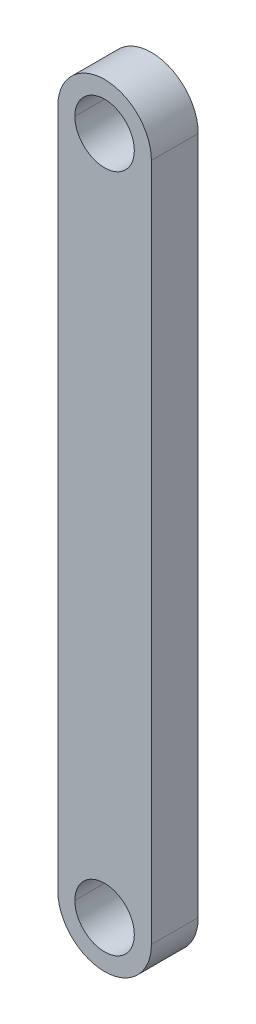
ISO-10303-21;
HEADER;
FILE_DESCRIPTION(('STEP AP214'),'2;1');
FILE_NAME('part.step','',(''),(''),'','','');
FILE_SCHEMA(('AUTOMOTIVE_DESIGN { 1 0 10303 214 1 1 1 1 }'));
ENDSEC;
DATA;
#1=APPLICATION_CONTEXT('core data for automotive mechanical design processes');
#2=APPLICATION_PROTOCOL_DEFINITION('international standard','automotive_design',2000,#1);
#3=PRODUCT_CONTEXT('',#1,'mechanical');
#4=PRODUCT('Part','Part','',(#3));
#5=PRODUCT_RELATED_PRODUCT_CATEGORY('part','',(#4));
#6=PRODUCT_DEFINITION_FORMATION('','',#4);
#7=PRODUCT_DEFINITION_CONTEXT('part definition',#1,'design');
#8=PRODUCT_DEFINITION('design','',#6,#7);
#9=PRODUCT_DEFINITION_SHAPE('','',#8);
#10=(LENGTH_UNIT() NAMED_UNIT(*) SI_UNIT(.MILLI.,.METRE.));
#11=(NAMED_UNIT(*) PLANE_ANGLE_UNIT() SI_UNIT($,.RADIAN.));
#12=(NAMED_UNIT(*) SI_UNIT($,.STERADIAN.) SOLID_ANGLE_UNIT());
#13=UNCERTAINTY_MEASURE_WITH_UNIT(LENGTH_MEASURE(1.E-05),#10,'distance_accuracy_value','');
#14=(GEOMETRIC_REPRESENTATION_CONTEXT(3) GLOBAL_UNCERTAINTY_ASSIGNED_CONTEXT((#13)) GLOBAL_UNIT_ASSIGNED_CONTEXT((#10,
#11,#12)) REPRESENTATION_CONTEXT('',''));
#15=CARTESIAN_POINT('',(0.,0.,0.));
#16=DIRECTION('',(0.,0.,1.));
#17=DIRECTION('',(1.,0.,0.));
#18=AXIS2_PLACEMENT_3D('',#15,#16,#17);
#19=CARTESIAN_POINT('',(0.,145.,0.));
#20=DIRECTION('',(0.,0.,1.));
#21=DIRECTION('',(1.,0.,0.));
#22=AXIS2_PLACEMENT_3D('',#19,#20,#21);
#23=CYLINDRICAL_SURFACE('',#22,6.35);
#24=DIRECTION('',(0.,0.,1.));
#25=VECTOR('',#24,1.);
#26=CARTESIAN_POINT('',(-6.35,145.,0.));
#27=LINE('',#26,#25);
#28=CARTESIAN_POINT('',(-6.35,145.,0.));
#29=VERTEX_POINT('',#28);
#30=CARTESIAN_POINT('',(-6.35,145.,10.));
#31=VERTEX_POINT('',#30);
#32=EDGE_CURVE('E109',#29,#31,#27,.T.);
#33=ORIENTED_EDGE('',*,*,#32,.F.);
#34=CARTESIAN_POINT('',(0.,145.,0.));
#35=DIRECTION('',(0.,0.,1.));
#36=DIRECTION('',(1.,0.,0.));
#37=AXIS2_PLACEMENT_3D('',#34,#35,#36);
#38=CIRCLE('',#37,6.35);
#39=CARTESIAN_POINT('',(6.35,145.,0.));
#40=VERTEX_POINT('',#39);
#41=EDGE_CURVE('E26',#40,#29,#38,.T.);
#42=ORIENTED_EDGE('',*,*,#41,.F.);
#43=DIRECTION('',(0.,0.,1.));
#44=VECTOR('',#43,1.);
#45=CARTESIAN_POINT('',(6.35,145.,0.));
#46=LINE('',#45,#44);
#47=CARTESIAN_POINT('',(6.35,145.,10.));
#48=VERTEX_POINT('',#47);
#49=EDGE_CURVE('E118',#40,#48,#46,.T.);
#50=ORIENTED_EDGE('',*,*,#49,.T.);
#51=CARTESIAN_POINT('',(0.,145.,10.));
#52=DIRECTION('',(0.,0.,1.));
#53=DIRECTION('',(1.,0.,0.));
#54=AXIS2_PLACEMENT_3D('',#51,#52,#53);
#55=CIRCLE('',#54,6.35);
#56=EDGE_CURVE('E110',#48,#31,#55,.T.);
#57=ORIENTED_EDGE('',*,*,#56,.T.);
#58=EDGE_LOOP('',(#33,#42,#50,#57));
#59=FACE_BOUND('',#58,.T.);
#60=ADVANCED_FACE('F15',(#59),#23,.F.);
#61=CARTESIAN_POINT('',(0.,0.,0.));
#62=DIRECTION('',(0.,0.,1.));
#63=DIRECTION('',(1.,0.,0.));
#64=AXIS2_PLACEMENT_3D('',#61,#62,#63);
#65=CYLINDRICAL_SURFACE('',#64,6.35);
#66=DIRECTION('',(0.,0.,1.));
#67=VECTOR('',#66,1.);
#68=CARTESIAN_POINT('',(-6.35,0.,0.));
#69=LINE('',#68,#67);
#70=CARTESIAN_POINT('',(-6.35,0.,0.));
#71=VERTEX_POINT('',#70);
#72=CARTESIAN_POINT('',(-6.35,0.,10.));
#73=VERTEX_POINT('',#72);
#74=EDGE_CURVE('E131',#71,#73,#69,.T.);
#75=ORIENTED_EDGE('',*,*,#74,.F.);
#76=CARTESIAN_POINT('',(0.,0.,0.));
#77=DIRECTION('',(0.,0.,1.));
#78=DIRECTION('',(1.,0.,0.));
#79=AXIS2_PLACEMENT_3D('',#76,#77,#78);
#80=CIRCLE('',#79,6.35);
#81=CARTESIAN_POINT('',(6.35,0.,0.));
#82=VERTEX_POINT('',#81);
#83=EDGE_CURVE('E10',#82,#71,#80,.T.);
#84=ORIENTED_EDGE('',*,*,#83,.F.);
#85=DIRECTION('',(0.,0.,1.));
#86=VECTOR('',#85,1.);
#87=CARTESIAN_POINT('',(6.35,0.,0.));
#88=LINE('',#87,#86);
#89=CARTESIAN_POINT('',(6.35,0.,10.));
#90=VERTEX_POINT('',#89);
#91=EDGE_CURVE('E168',#82,#90,#88,.T.);
#92=ORIENTED_EDGE('',*,*,#91,.T.);
#93=CARTESIAN_POINT('',(0.,0.,10.));
#94=DIRECTION('',(0.,0.,1.));
#95=DIRECTION('',(1.,0.,0.));
#96=AXIS2_PLACEMENT_3D('',#93,#94,#95);
#97=CIRCLE('',#96,6.35);
#98=EDGE_CURVE('E106',#90,#73,#97,.T.);
#99=ORIENTED_EDGE('',*,*,#98,.T.);
#100=EDGE_LOOP('',(#75,#84,#92,#99));
#101=FACE_BOUND('',#100,.T.);
#102=ADVANCED_FACE('F220',(#101),#65,.F.);
#103=CARTESIAN_POINT('',(0.,0.,0.));
#104=DIRECTION('',(0.,0.,1.));
#105=DIRECTION('',(1.,0.,0.));
#106=AXIS2_PLACEMENT_3D('',#103,#104,#105);
#107=PLANE('',#106);
#108=ORIENTED_EDGE('',*,*,#83,.T.);
#109=CARTESIAN_POINT('',(0.,0.,0.));
#110=DIRECTION('',(0.,0.,1.));
#111=DIRECTION('',(1.,0.,0.));
#112=AXIS2_PLACEMENT_3D('',#109,#110,#111);
#113=CIRCLE('',#112,6.35);
#114=EDGE_CURVE('E128',#71,#82,#113,.T.);
#115=ORIENTED_EDGE('',*,*,#114,.T.);
#116=EDGE_LOOP('',(#108,#115));
#117=FACE_BOUND('',#116,.T.);
#118=ORIENTED_EDGE('',*,*,#41,.T.);
#119=CARTESIAN_POINT('',(0.,145.,0.));
#120=DIRECTION('',(0.,0.,1.));
#121=DIRECTION('',(1.,0.,0.));
#122=AXIS2_PLACEMENT_3D('',#119,#120,#121);
#123=CIRCLE('',#122,6.35);
#124=EDGE_CURVE('E101',#29,#40,#123,.T.);
#125=ORIENTED_EDGE('',*,*,#124,.T.);
#126=EDGE_LOOP('',(#118,#125));
#127=FACE_BOUND('',#126,.T.);
#128=CARTESIAN_POINT('',(0.,0.,0.));
#129=DIRECTION('',(0.,0.,1.));
#130=DIRECTION('',(1.,0.,0.));
#131=AXIS2_PLACEMENT_3D('',#128,#129,#130);
#132=CIRCLE('',#131,10.);
#133=CARTESIAN_POINT('',(-10.,0.,0.));
#134=VERTEX_POINT('',#133);
#135=CARTESIAN_POINT('',(10.,0.,0.));
#136=VERTEX_POINT('',#135);
#137=EDGE_CURVE('E137',#134,#136,#132,.T.);
#138=ORIENTED_EDGE('',*,*,#137,.F.);
#139=DIRECTION('',(0.,-1.,0.));
#140=VECTOR('',#139,1.);
#141=CARTESIAN_POINT('',(-10.,0.,0.));
#142=LINE('',#141,#140);
#143=CARTESIAN_POINT('',(-10.,145.,0.));
#144=VERTEX_POINT('',#143);
#145=EDGE_CURVE('E151',#144,#134,#142,.T.);
#146=ORIENTED_EDGE('',*,*,#145,.F.);
#147=CARTESIAN_POINT('',(0.,145.,0.));
#148=DIRECTION('',(0.,0.,1.));
#149=DIRECTION('',(1.,0.,0.));
#150=AXIS2_PLACEMENT_3D('',#147,#148,#149);
#151=CIRCLE('',#150,10.);
#152=CARTESIAN_POINT('',(10.,145.,0.));
#153=VERTEX_POINT('',#152);
#154=EDGE_CURVE('E145',#153,#144,#151,.T.);
#155=ORIENTED_EDGE('',*,*,#154,.F.);
#156=DIRECTION('',(0.,1.,0.));
#157=VECTOR('',#156,1.);
#158=CARTESIAN_POINT('',(10.,0.,0.));
#159=LINE('',#158,#157);
#160=EDGE_CURVE('E171',#136,#153,#159,.T.);
#161=ORIENTED_EDGE('',*,*,#160,.F.);
#162=EDGE_LOOP('',(#138,#146,#155,#161));
#163=FACE_BOUND('',#162,.T.);
#164=ADVANCED_FACE('F98',(#117,#127,#163),#107,.F.);
#165=CARTESIAN_POINT('',(0.,0.,10.));
#166=DIRECTION('',(0.,0.,1.));
#167=DIRECTION('',(1.,0.,0.));
#168=AXIS2_PLACEMENT_3D('',#165,#166,#167);
#169=PLANE('',#168);
#170=ORIENTED_EDGE('',*,*,#98,.F.);
#171=CARTESIAN_POINT('',(0.,0.,10.));
#172=DIRECTION('',(0.,0.,1.));
#173=DIRECTION('',(1.,0.,0.));
#174=AXIS2_PLACEMENT_3D('',#171,#172,#173);
#175=CIRCLE('',#174,6.35);
#176=EDGE_CURVE('E178',#73,#90,#175,.T.);
#177=ORIENTED_EDGE('',*,*,#176,.F.);
#178=EDGE_LOOP('',(#170,#177));
#179=FACE_BOUND('',#178,.T.);
#180=ORIENTED_EDGE('',*,*,#56,.F.);
#181=CARTESIAN_POINT('',(0.,145.,10.));
#182=DIRECTION('',(0.,0.,1.));
#183=DIRECTION('',(1.,0.,0.));
#184=AXIS2_PLACEMENT_3D('',#181,#182,#183);
#185=CIRCLE('',#184,6.35);
#186=EDGE_CURVE('E115',#31,#48,#185,.T.);
#187=ORIENTED_EDGE('',*,*,#186,.F.);
#188=EDGE_LOOP('',(#180,#187));
#189=FACE_BOUND('',#188,.T.);
#190=CARTESIAN_POINT('',(0.,0.,10.));
#191=DIRECTION('',(0.,0.,1.));
#192=DIRECTION('',(1.,0.,0.));
#193=AXIS2_PLACEMENT_3D('',#190,#191,#192);
#194=CIRCLE('',#193,10.);
#195=CARTESIAN_POINT('',(-10.,0.,10.));
#196=VERTEX_POINT('',#195);
#197=CARTESIAN_POINT('',(10.,0.,10.));
#198=VERTEX_POINT('',#197);
#199=EDGE_CURVE('E136',#196,#198,#194,.T.);
#200=ORIENTED_EDGE('',*,*,#199,.T.);
#201=DIRECTION('',(0.,1.,0.));
#202=VECTOR('',#201,1.);
#203=CARTESIAN_POINT('',(10.,0.,10.));
#204=LINE('',#203,#202);
#205=CARTESIAN_POINT('',(10.,145.,10.));
#206=VERTEX_POINT('',#205);
#207=EDGE_CURVE('E19',#198,#206,#204,.T.);
#208=ORIENTED_EDGE('',*,*,#207,.T.);
#209=CARTESIAN_POINT('',(0.,145.,10.));
#210=DIRECTION('',(0.,0.,1.));
#211=DIRECTION('',(1.,0.,0.));
#212=AXIS2_PLACEMENT_3D('',#209,#210,#211);
#213=CIRCLE('',#212,10.);
#214=CARTESIAN_POINT('',(-10.,145.,10.));
#215=VERTEX_POINT('',#214);
#216=EDGE_CURVE('E144',#206,#215,#213,.T.);
#217=ORIENTED_EDGE('',*,*,#216,.T.);
#218=DIRECTION('',(0.,-1.,0.));
#219=VECTOR('',#218,1.);
#220=CARTESIAN_POINT('',(-10.,0.,10.));
#221=LINE('',#220,#219);
#222=EDGE_CURVE('E40',#215,#196,#221,.T.);
#223=ORIENTED_EDGE('',*,*,#222,.T.);
#224=EDGE_LOOP('',(#200,#208,#217,#223));
#225=FACE_BOUND('',#224,.T.);
#226=ADVANCED_FACE('F197',(#179,#189,#225),#169,.T.);
#227=CARTESIAN_POINT('',(-10.,0.,10.));
#228=DIRECTION('',(1.,0.,0.));
#229=DIRECTION('',(0.,1.,0.));
#230=AXIS2_PLACEMENT_3D('',#227,#228,#229);
#231=PLANE('',#230);
#232=ORIENTED_EDGE('',*,*,#145,.T.);
#233=DIRECTION('',(0.,0.,-1.));
#234=VECTOR('',#233,1.);
#235=CARTESIAN_POINT('',(-10.,0.,10.));
#236=LINE('',#235,#234);
#237=EDGE_CURVE('E141',#196,#134,#236,.T.);
#238=ORIENTED_EDGE('',*,*,#237,.F.);
#239=ORIENTED_EDGE('',*,*,#222,.F.);
#240=DIRECTION('',(0.,0.,-1.));
#241=VECTOR('',#240,1.);
#242=CARTESIAN_POINT('',(-10.,145.,10.));
#243=LINE('',#242,#241);
#244=EDGE_CURVE('E142',#215,#144,#243,.T.);
#245=ORIENTED_EDGE('',*,*,#244,.T.);
#246=EDGE_LOOP('',(#232,#238,#239,#245));
#247=FACE_BOUND('',#246,.T.);
#248=ADVANCED_FACE('F200',(#247),#231,.F.);
#249=CARTESIAN_POINT('',(0.,145.,10.));
#250=DIRECTION('',(0.,0.,-1.));
#251=DIRECTION('',(-1.,0.,0.));
#252=AXIS2_PLACEMENT_3D('',#249,#250,#251);
#253=CYLINDRICAL_SURFACE('',#252,10.);
#254=ORIENTED_EDGE('',*,*,#154,.T.);
#255=ORIENTED_EDGE('',*,*,#244,.F.);
#256=ORIENTED_EDGE('',*,*,#216,.F.);
#257=DIRECTION('',(0.,0.,-1.));
#258=VECTOR('',#257,1.);
#259=CARTESIAN_POINT('',(10.,145.,10.));
#260=LINE('',#259,#258);
#261=EDGE_CURVE('E162',#206,#153,#260,.T.);
#262=ORIENTED_EDGE('',*,*,#261,.T.);
#263=EDGE_LOOP('',(#254,#255,#256,#262));
#264=FACE_BOUND('',#263,.T.);
#265=ADVANCED_FACE('F207',(#264),#253,.T.);
#266=CARTESIAN_POINT('',(10.,0.,10.));
#267=DIRECTION('',(-1.,0.,0.));
#268=DIRECTION('',(0.,0.,1.));
#269=AXIS2_PLACEMENT_3D('',#266,#267,#268);
#270=PLANE('',#269);
#271=ORIENTED_EDGE('',*,*,#160,.T.);
#272=ORIENTED_EDGE('',*,*,#261,.F.);
#273=ORIENTED_EDGE('',*,*,#207,.F.);
#274=DIRECTION('',(0.,0.,-1.));
#275=VECTOR('',#274,1.);
#276=CARTESIAN_POINT('',(10.,0.,10.));
#277=LINE('',#276,#275);
#278=EDGE_CURVE('E132',#198,#136,#277,.T.);
#279=ORIENTED_EDGE('',*,*,#278,.T.);
#280=EDGE_LOOP('',(#271,#272,#273,#279));
#281=FACE_BOUND('',#280,.T.);
#282=ADVANCED_FACE('F205',(#281),#270,.F.);
#283=CARTESIAN_POINT('',(0.,0.,10.));
#284=DIRECTION('',(0.,0.,-1.));
#285=DIRECTION('',(-1.,0.,0.));
#286=AXIS2_PLACEMENT_3D('',#283,#284,#285);
#287=CYLINDRICAL_SURFACE('',#286,10.);
#288=ORIENTED_EDGE('',*,*,#137,.T.);
#289=ORIENTED_EDGE('',*,*,#278,.F.);
#290=ORIENTED_EDGE('',*,*,#199,.F.);
#291=ORIENTED_EDGE('',*,*,#237,.T.);
#292=EDGE_LOOP('',(#288,#289,#290,#291));
#293=FACE_BOUND('',#292,.T.);
#294=ADVANCED_FACE('F203',(#293),#287,.T.);
#295=CARTESIAN_POINT('',(0.,0.,0.));
#296=DIRECTION('',(0.,0.,1.));
#297=DIRECTION('',(1.,0.,0.));
#298=AXIS2_PLACEMENT_3D('',#295,#296,#297);
#299=CYLINDRICAL_SURFACE('',#298,6.35);
#300=ORIENTED_EDGE('',*,*,#114,.F.);
#301=ORIENTED_EDGE('',*,*,#74,.T.);
#302=ORIENTED_EDGE('',*,*,#176,.T.);
#303=ORIENTED_EDGE('',*,*,#91,.F.);
#304=EDGE_LOOP('',(#300,#301,#302,#303));
#305=FACE_BOUND('',#304,.T.);
#306=ADVANCED_FACE('F17',(#305),#299,.F.);
#307=CARTESIAN_POINT('',(0.,145.,0.));
#308=DIRECTION('',(0.,0.,1.));
#309=DIRECTION('',(1.,0.,0.));
#310=AXIS2_PLACEMENT_3D('',#307,#308,#309);
#311=CYLINDRICAL_SURFACE('',#310,6.35);
#312=ORIENTED_EDGE('',*,*,#124,.F.);
#313=ORIENTED_EDGE('',*,*,#32,.T.);
#314=ORIENTED_EDGE('',*,*,#186,.T.);
#315=ORIENTED_EDGE('',*,*,#49,.F.);
#316=EDGE_LOOP('',(#312,#313,#314,#315));
#317=FACE_BOUND('',#316,.T.);
#318=ADVANCED_FACE('F117',(#317),#311,.F.);
#319=CLOSED_SHELL('',(#60,#102,#164,#226,#248,#265,#282,#294,#306,#318));
#320=MANIFOLD_SOLID_BREP('B1',#319);
#321=ADVANCED_BREP_SHAPE_REPRESENTATION('',(#18,#320),#14);
#322=SHAPE_DEFINITION_REPRESENTATION(#9,#321);
ENDSEC;
END-ISO-10303-21;
